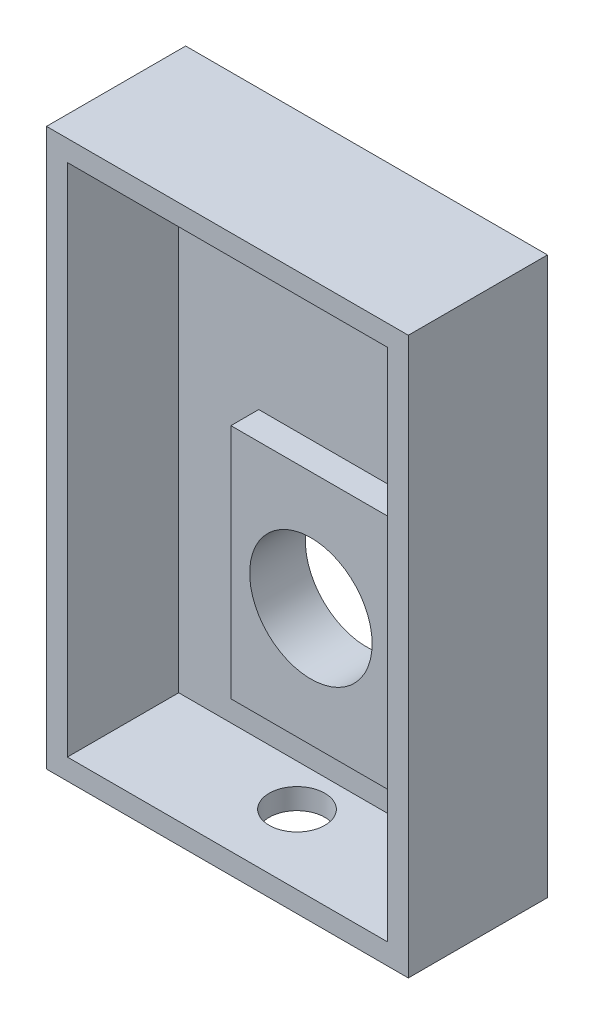
ISO-10303-21;
HEADER;
FILE_DESCRIPTION(('STEP AP214'),'2;1');
FILE_NAME('part.step','',(''),(''),'','','');
FILE_SCHEMA(('AUTOMOTIVE_DESIGN { 1 0 10303 214 1 1 1 1 }'));
ENDSEC;
DATA;
#1=APPLICATION_CONTEXT('core data for automotive mechanical design processes');
#2=APPLICATION_PROTOCOL_DEFINITION('international standard','automotive_design',2000,#1);
#3=PRODUCT_CONTEXT('',#1,'mechanical');
#4=PRODUCT('Part','Part','',(#3));
#5=PRODUCT_RELATED_PRODUCT_CATEGORY('part','',(#4));
#6=PRODUCT_DEFINITION_FORMATION('','',#4);
#7=PRODUCT_DEFINITION_CONTEXT('part definition',#1,'design');
#8=PRODUCT_DEFINITION('design','',#6,#7);
#9=PRODUCT_DEFINITION_SHAPE('','',#8);
#10=(LENGTH_UNIT() NAMED_UNIT(*) SI_UNIT(.MILLI.,.METRE.));
#11=(NAMED_UNIT(*) PLANE_ANGLE_UNIT() SI_UNIT($,.RADIAN.));
#12=(NAMED_UNIT(*) SI_UNIT($,.STERADIAN.) SOLID_ANGLE_UNIT());
#13=UNCERTAINTY_MEASURE_WITH_UNIT(LENGTH_MEASURE(1.E-05),#10,'distance_accuracy_value','');
#14=(GEOMETRIC_REPRESENTATION_CONTEXT(3) GLOBAL_UNCERTAINTY_ASSIGNED_CONTEXT((#13)) GLOBAL_UNIT_ASSIGNED_CONTEXT((#10,
#11,#12)) REPRESENTATION_CONTEXT('',''));
#15=CARTESIAN_POINT('',(0.,0.,0.));
#16=DIRECTION('',(0.,0.,1.));
#17=DIRECTION('',(1.,0.,0.));
#18=AXIS2_PLACEMENT_3D('',#15,#16,#17);
#19=CARTESIAN_POINT('',(0.,0.,2.));
#20=DIRECTION('',(0.,0.,1.));
#21=DIRECTION('',(1.,0.,0.));
#22=AXIS2_PLACEMENT_3D('',#19,#20,#21);
#23=PLANE('',#22);
#24=DIRECTION('',(-1.,0.,0.));
#25=VECTOR('',#24,1.);
#26=CARTESIAN_POINT('',(24.5,-1.5,2.));
#27=LINE('',#26,#25);
#28=CARTESIAN_POINT('',(24.5,-1.5,2.));
#29=VERTEX_POINT('',#28);
#30=CARTESIAN_POINT('',(1.5,-1.5,2.));
#31=VERTEX_POINT('',#30);
#32=EDGE_CURVE('E51',#29,#31,#27,.T.);
#33=ORIENTED_EDGE('',*,*,#32,.T.);
#34=DIRECTION('',(0.,-1.,0.));
#35=VECTOR('',#34,1.);
#36=CARTESIAN_POINT('',(1.5,-1.5,2.));
#37=LINE('',#36,#35);
#38=CARTESIAN_POINT('',(1.5,-38.5,2.));
#39=VERTEX_POINT('',#38);
#40=EDGE_CURVE('E55',#31,#39,#37,.T.);
#41=ORIENTED_EDGE('',*,*,#40,.T.);
#42=DIRECTION('',(1.,0.,0.));
#43=VECTOR('',#42,1.);
#44=CARTESIAN_POINT('',(1.5,-38.5,2.));
#45=LINE('',#44,#43);
#46=CARTESIAN_POINT('',(24.5,-38.5,2.));
#47=VERTEX_POINT('',#46);
#48=EDGE_CURVE('E154',#39,#47,#45,.T.);
#49=ORIENTED_EDGE('',*,*,#48,.T.);
#50=DIRECTION('',(0.,1.,0.));
#51=VECTOR('',#50,1.);
#52=CARTESIAN_POINT('',(24.5,-38.5,2.));
#53=LINE('',#52,#51);
#54=EDGE_CURVE('E134',#47,#29,#53,.T.);
#55=ORIENTED_EDGE('',*,*,#54,.T.);
#56=EDGE_LOOP('',(#33,#41,#49,#55));
#57=FACE_BOUND('',#56,.T.);
#58=DIRECTION('',(1.,0.,0.));
#59=VECTOR('',#58,1.);
#60=CARTESIAN_POINT('',(7.25,-35.,2.));
#61=LINE('',#60,#59);
#62=CARTESIAN_POINT('',(7.25,-35.,2.));
#63=VERTEX_POINT('',#62);
#64=CARTESIAN_POINT('',(18.75,-35.,2.));
#65=VERTEX_POINT('',#64);
#66=EDGE_CURVE('E190',#63,#65,#61,.T.);
#67=ORIENTED_EDGE('',*,*,#66,.F.);
#68=DIRECTION('',(0.,-1.,0.));
#69=VECTOR('',#68,1.);
#70=CARTESIAN_POINT('',(7.25,-18.,2.));
#71=LINE('',#70,#69);
#72=CARTESIAN_POINT('',(7.25,-18.,2.));
#73=VERTEX_POINT('',#72);
#74=EDGE_CURVE('E176',#73,#63,#71,.T.);
#75=ORIENTED_EDGE('',*,*,#74,.F.);
#76=DIRECTION('',(-1.,0.,0.));
#77=VECTOR('',#76,1.);
#78=CARTESIAN_POINT('',(7.25,-18.,2.));
#79=LINE('',#78,#77);
#80=CARTESIAN_POINT('',(18.75,-18.,2.));
#81=VERTEX_POINT('',#80);
#82=EDGE_CURVE('E181',#81,#73,#79,.T.);
#83=ORIENTED_EDGE('',*,*,#82,.F.);
#84=DIRECTION('',(0.,1.,0.));
#85=VECTOR('',#84,1.);
#86=CARTESIAN_POINT('',(18.75,-18.,2.));
#87=LINE('',#86,#85);
#88=EDGE_CURVE('E192',#65,#81,#87,.T.);
#89=ORIENTED_EDGE('',*,*,#88,.F.);
#90=EDGE_LOOP('',(#67,#75,#83,#89));
#91=FACE_BOUND('',#90,.T.);
#92=ADVANCED_FACE('F35',(#57,#91),#23,.T.);
#93=CARTESIAN_POINT('',(0.,0.,0.));
#94=DIRECTION('',(0.,0.,1.));
#95=DIRECTION('',(1.,0.,0.));
#96=AXIS2_PLACEMENT_3D('',#93,#94,#95);
#97=PLANE('',#96);
#98=DIRECTION('',(0.,-1.,0.));
#99=VECTOR('',#98,1.);
#100=CARTESIAN_POINT('',(0.,0.,0.));
#101=LINE('',#100,#99);
#102=CARTESIAN_POINT('',(0.,0.,0.));
#103=VERTEX_POINT('',#102);
#104=CARTESIAN_POINT('',(0.,-40.,0.));
#105=VERTEX_POINT('',#104);
#106=EDGE_CURVE('E208',#103,#105,#101,.T.);
#107=ORIENTED_EDGE('',*,*,#106,.F.);
#108=DIRECTION('',(-1.,0.,0.));
#109=VECTOR('',#108,1.);
#110=CARTESIAN_POINT('',(0.,0.,0.));
#111=LINE('',#110,#109);
#112=CARTESIAN_POINT('',(26.,0.,0.));
#113=VERTEX_POINT('',#112);
#114=EDGE_CURVE('E215',#113,#103,#111,.T.);
#115=ORIENTED_EDGE('',*,*,#114,.F.);
#116=DIRECTION('',(0.,1.,0.));
#117=VECTOR('',#116,1.);
#118=CARTESIAN_POINT('',(26.,0.,0.));
#119=LINE('',#118,#117);
#120=CARTESIAN_POINT('',(26.,-40.,0.));
#121=VERTEX_POINT('',#120);
#122=EDGE_CURVE('E213',#121,#113,#119,.T.);
#123=ORIENTED_EDGE('',*,*,#122,.F.);
#124=DIRECTION('',(1.,0.,0.));
#125=VECTOR('',#124,1.);
#126=CARTESIAN_POINT('',(0.,-40.,0.));
#127=LINE('',#126,#125);
#128=EDGE_CURVE('E211',#105,#121,#127,.T.);
#129=ORIENTED_EDGE('',*,*,#128,.F.);
#130=EDGE_LOOP('',(#107,#115,#123,#129));
#131=FACE_BOUND('',#130,.T.);
#132=CARTESIAN_POINT('',(13.,-26.5,0.));
#133=DIRECTION('',(0.,0.,1.));
#134=DIRECTION('',(1.,0.,0.));
#135=AXIS2_PLACEMENT_3D('',#132,#133,#134);
#136=CIRCLE('',#135,4.4);
#137=CARTESIAN_POINT('',(17.4,-26.5,0.));
#138=VERTEX_POINT('',#137);
#139=EDGE_CURVE('E205',#138,#138,#136,.T.);
#140=ORIENTED_EDGE('',*,*,#139,.T.);
#141=EDGE_LOOP('',(#140));
#142=FACE_BOUND('',#141,.T.);
#143=ADVANCED_FACE('F233',(#131,#142),#97,.F.);
#144=CARTESIAN_POINT('',(0.,0.,2.));
#145=DIRECTION('',(1.,0.,0.));
#146=DIRECTION('',(0.,0.,-1.));
#147=AXIS2_PLACEMENT_3D('',#144,#145,#146);
#148=PLANE('',#147);
#149=ORIENTED_EDGE('',*,*,#106,.T.);
#150=DIRECTION('',(0.,0.,-1.));
#151=VECTOR('',#150,1.);
#152=CARTESIAN_POINT('',(0.,-40.,2.));
#153=LINE('',#152,#151);
#154=CARTESIAN_POINT('',(0.,-40.,10.));
#155=VERTEX_POINT('',#154);
#156=EDGE_CURVE('E11',#155,#105,#153,.T.);
#157=ORIENTED_EDGE('',*,*,#156,.F.);
#158=DIRECTION('',(0.,-1.,0.));
#159=VECTOR('',#158,1.);
#160=CARTESIAN_POINT('',(0.,0.,10.));
#161=LINE('',#160,#159);
#162=CARTESIAN_POINT('',(0.,0.,10.));
#163=VERTEX_POINT('',#162);
#164=EDGE_CURVE('E164',#163,#155,#161,.T.);
#165=ORIENTED_EDGE('',*,*,#164,.F.);
#166=DIRECTION('',(0.,0.,-1.));
#167=VECTOR('',#166,1.);
#168=CARTESIAN_POINT('',(0.,0.,2.));
#169=LINE('',#168,#167);
#170=EDGE_CURVE('E217',#163,#103,#169,.T.);
#171=ORIENTED_EDGE('',*,*,#170,.T.);
#172=EDGE_LOOP('',(#149,#157,#165,#171));
#173=FACE_BOUND('',#172,.T.);
#174=ADVANCED_FACE('F37',(#173),#148,.F.);
#175=CARTESIAN_POINT('',(0.,-40.,2.));
#176=DIRECTION('',(0.,1.,0.));
#177=DIRECTION('',(0.,0.,1.));
#178=AXIS2_PLACEMENT_3D('',#175,#176,#177);
#179=PLANE('',#178);
#180=CARTESIAN_POINT('',(13.,-40.,5.));
#181=DIRECTION('',(0.,-1.,0.));
#182=DIRECTION('',(0.,0.,-1.));
#183=AXIS2_PLACEMENT_3D('',#180,#181,#182);
#184=CIRCLE('',#183,2.);
#185=CARTESIAN_POINT('',(13.,-40.,3.));
#186=VERTEX_POINT('',#185);
#187=EDGE_CURVE('E439',#186,#186,#184,.T.);
#188=ORIENTED_EDGE('',*,*,#187,.F.);
#189=EDGE_LOOP('',(#188));
#190=FACE_BOUND('',#189,.T.);
#191=ORIENTED_EDGE('',*,*,#128,.T.);
#192=DIRECTION('',(0.,0.,-1.));
#193=VECTOR('',#192,1.);
#194=CARTESIAN_POINT('',(26.,-40.,2.));
#195=LINE('',#194,#193);
#196=CARTESIAN_POINT('',(26.,-40.,10.));
#197=VERTEX_POINT('',#196);
#198=EDGE_CURVE('E44',#197,#121,#195,.T.);
#199=ORIENTED_EDGE('',*,*,#198,.F.);
#200=DIRECTION('',(1.,0.,0.));
#201=VECTOR('',#200,1.);
#202=CARTESIAN_POINT('',(0.,-40.,10.));
#203=LINE('',#202,#201);
#204=EDGE_CURVE('E167',#155,#197,#203,.T.);
#205=ORIENTED_EDGE('',*,*,#204,.F.);
#206=ORIENTED_EDGE('',*,*,#156,.T.);
#207=EDGE_LOOP('',(#191,#199,#205,#206));
#208=FACE_BOUND('',#207,.T.);
#209=ADVANCED_FACE('F241',(#190,#208),#179,.F.);
#210=CARTESIAN_POINT('',(26.,0.,2.));
#211=DIRECTION('',(-1.,0.,0.));
#212=DIRECTION('',(0.,0.,1.));
#213=AXIS2_PLACEMENT_3D('',#210,#211,#212);
#214=PLANE('',#213);
#215=ORIENTED_EDGE('',*,*,#122,.T.);
#216=DIRECTION('',(0.,0.,-1.));
#217=VECTOR('',#216,1.);
#218=CARTESIAN_POINT('',(26.,0.,2.));
#219=LINE('',#218,#217);
#220=CARTESIAN_POINT('',(26.,0.,10.));
#221=VERTEX_POINT('',#220);
#222=EDGE_CURVE('E220',#221,#113,#219,.T.);
#223=ORIENTED_EDGE('',*,*,#222,.F.);
#224=DIRECTION('',(0.,1.,0.));
#225=VECTOR('',#224,1.);
#226=CARTESIAN_POINT('',(26.,-40.,10.));
#227=LINE('',#226,#225);
#228=EDGE_CURVE('E170',#197,#221,#227,.T.);
#229=ORIENTED_EDGE('',*,*,#228,.F.);
#230=ORIENTED_EDGE('',*,*,#198,.T.);
#231=EDGE_LOOP('',(#215,#223,#229,#230));
#232=FACE_BOUND('',#231,.T.);
#233=ADVANCED_FACE('F227',(#232),#214,.F.);
#234=CARTESIAN_POINT('',(0.,0.,2.));
#235=DIRECTION('',(0.,-1.,0.));
#236=DIRECTION('',(0.,0.,-1.));
#237=AXIS2_PLACEMENT_3D('',#234,#235,#236);
#238=PLANE('',#237);
#239=ORIENTED_EDGE('',*,*,#114,.T.);
#240=ORIENTED_EDGE('',*,*,#170,.F.);
#241=DIRECTION('',(-1.,0.,0.));
#242=VECTOR('',#241,1.);
#243=CARTESIAN_POINT('',(26.,0.,10.));
#244=LINE('',#243,#242);
#245=EDGE_CURVE('E139',#221,#163,#244,.T.);
#246=ORIENTED_EDGE('',*,*,#245,.F.);
#247=ORIENTED_EDGE('',*,*,#222,.T.);
#248=EDGE_LOOP('',(#239,#240,#246,#247));
#249=FACE_BOUND('',#248,.T.);
#250=ADVANCED_FACE('F236',(#249),#238,.F.);
#251=CARTESIAN_POINT('',(13.,-26.5,2.));
#252=DIRECTION('',(0.,0.,-1.));
#253=DIRECTION('',(-1.,0.,0.));
#254=AXIS2_PLACEMENT_3D('',#251,#252,#253);
#255=CYLINDRICAL_SURFACE('',#254,4.4);
#256=ORIENTED_EDGE('',*,*,#139,.F.);
#257=EDGE_LOOP('',(#256));
#258=FACE_BOUND('',#257,.T.);
#259=CARTESIAN_POINT('',(13.,-26.5,4.));
#260=DIRECTION('',(0.,0.,1.));
#261=DIRECTION('',(1.,0.,0.));
#262=AXIS2_PLACEMENT_3D('',#259,#260,#261);
#263=CIRCLE('',#262,4.4);
#264=CARTESIAN_POINT('',(17.4,-26.5,4.));
#265=VERTEX_POINT('',#264);
#266=EDGE_CURVE('E173',#265,#265,#263,.T.);
#267=ORIENTED_EDGE('',*,*,#266,.T.);
#268=EDGE_LOOP('',(#267));
#269=FACE_BOUND('',#268,.T.);
#270=ADVANCED_FACE('F258',(#258,#269),#255,.F.);
#271=CARTESIAN_POINT('',(0.,0.,4.));
#272=DIRECTION('',(0.,0.,1.));
#273=DIRECTION('',(1.,0.,0.));
#274=AXIS2_PLACEMENT_3D('',#271,#272,#273);
#275=PLANE('',#274);
#276=DIRECTION('',(0.,-1.,0.));
#277=VECTOR('',#276,1.);
#278=CARTESIAN_POINT('',(7.25,-18.,4.));
#279=LINE('',#278,#277);
#280=CARTESIAN_POINT('',(7.25,-18.,4.));
#281=VERTEX_POINT('',#280);
#282=CARTESIAN_POINT('',(7.25,-35.,4.));
#283=VERTEX_POINT('',#282);
#284=EDGE_CURVE('E177',#281,#283,#279,.T.);
#285=ORIENTED_EDGE('',*,*,#284,.T.);
#286=DIRECTION('',(1.,0.,0.));
#287=VECTOR('',#286,1.);
#288=CARTESIAN_POINT('',(7.25,-35.,4.));
#289=LINE('',#288,#287);
#290=CARTESIAN_POINT('',(18.75,-35.,4.));
#291=VERTEX_POINT('',#290);
#292=EDGE_CURVE('E180',#283,#291,#289,.T.);
#293=ORIENTED_EDGE('',*,*,#292,.T.);
#294=DIRECTION('',(0.,1.,0.));
#295=VECTOR('',#294,1.);
#296=CARTESIAN_POINT('',(18.75,-18.,4.));
#297=LINE('',#296,#295);
#298=CARTESIAN_POINT('',(18.75,-18.,4.));
#299=VERTEX_POINT('',#298);
#300=EDGE_CURVE('E183',#291,#299,#297,.T.);
#301=ORIENTED_EDGE('',*,*,#300,.T.);
#302=DIRECTION('',(-1.,0.,0.));
#303=VECTOR('',#302,1.);
#304=CARTESIAN_POINT('',(7.25,-18.,4.));
#305=LINE('',#304,#303);
#306=EDGE_CURVE('E185',#299,#281,#305,.T.);
#307=ORIENTED_EDGE('',*,*,#306,.T.);
#308=EDGE_LOOP('',(#285,#293,#301,#307));
#309=FACE_BOUND('',#308,.T.);
#310=ORIENTED_EDGE('',*,*,#266,.F.);
#311=EDGE_LOOP('',(#310));
#312=FACE_BOUND('',#311,.T.);
#313=ADVANCED_FACE('F265',(#309,#312),#275,.T.);
#314=CARTESIAN_POINT('',(7.25,-18.,4.));
#315=DIRECTION('',(1.,0.,0.));
#316=DIRECTION('',(0.,1.,0.));
#317=AXIS2_PLACEMENT_3D('',#314,#315,#316);
#318=PLANE('',#317);
#319=ORIENTED_EDGE('',*,*,#74,.T.);
#320=DIRECTION('',(0.,0.,-1.));
#321=VECTOR('',#320,1.);
#322=CARTESIAN_POINT('',(7.25,-35.,4.));
#323=LINE('',#322,#321);
#324=EDGE_CURVE('E203',#283,#63,#323,.T.);
#325=ORIENTED_EDGE('',*,*,#324,.F.);
#326=ORIENTED_EDGE('',*,*,#284,.F.);
#327=DIRECTION('',(0.,0.,-1.));
#328=VECTOR('',#327,1.);
#329=CARTESIAN_POINT('',(7.25,-18.,4.));
#330=LINE('',#329,#328);
#331=EDGE_CURVE('E187',#281,#73,#330,.T.);
#332=ORIENTED_EDGE('',*,*,#331,.T.);
#333=EDGE_LOOP('',(#319,#325,#326,#332));
#334=FACE_BOUND('',#333,.T.);
#335=ADVANCED_FACE('F270',(#334),#318,.F.);
#336=CARTESIAN_POINT('',(7.25,-35.,4.));
#337=DIRECTION('',(0.,1.,0.));
#338=DIRECTION('',(0.,0.,1.));
#339=AXIS2_PLACEMENT_3D('',#336,#337,#338);
#340=PLANE('',#339);
#341=ORIENTED_EDGE('',*,*,#66,.T.);
#342=DIRECTION('',(0.,0.,-1.));
#343=VECTOR('',#342,1.);
#344=CARTESIAN_POINT('',(18.75,-35.,4.));
#345=LINE('',#344,#343);
#346=EDGE_CURVE('E200',#291,#65,#345,.T.);
#347=ORIENTED_EDGE('',*,*,#346,.F.);
#348=ORIENTED_EDGE('',*,*,#292,.F.);
#349=ORIENTED_EDGE('',*,*,#324,.T.);
#350=EDGE_LOOP('',(#341,#347,#348,#349));
#351=FACE_BOUND('',#350,.T.);
#352=ADVANCED_FACE('F280',(#351),#340,.F.);
#353=CARTESIAN_POINT('',(18.75,-18.,4.));
#354=DIRECTION('',(-1.,0.,0.));
#355=DIRECTION('',(0.,-1.,0.));
#356=AXIS2_PLACEMENT_3D('',#353,#354,#355);
#357=PLANE('',#356);
#358=ORIENTED_EDGE('',*,*,#88,.T.);
#359=DIRECTION('',(0.,0.,-1.));
#360=VECTOR('',#359,1.);
#361=CARTESIAN_POINT('',(18.75,-18.,4.));
#362=LINE('',#361,#360);
#363=EDGE_CURVE('E198',#299,#81,#362,.T.);
#364=ORIENTED_EDGE('',*,*,#363,.F.);
#365=ORIENTED_EDGE('',*,*,#300,.F.);
#366=ORIENTED_EDGE('',*,*,#346,.T.);
#367=EDGE_LOOP('',(#358,#364,#365,#366));
#368=FACE_BOUND('',#367,.T.);
#369=ADVANCED_FACE('F288',(#368),#357,.F.);
#370=CARTESIAN_POINT('',(7.25,-18.,4.));
#371=DIRECTION('',(0.,-1.,0.));
#372=DIRECTION('',(0.,0.,-1.));
#373=AXIS2_PLACEMENT_3D('',#370,#371,#372);
#374=PLANE('',#373);
#375=ORIENTED_EDGE('',*,*,#82,.T.);
#376=ORIENTED_EDGE('',*,*,#331,.F.);
#377=ORIENTED_EDGE('',*,*,#306,.F.);
#378=ORIENTED_EDGE('',*,*,#363,.T.);
#379=EDGE_LOOP('',(#375,#376,#377,#378));
#380=FACE_BOUND('',#379,.T.);
#381=ADVANCED_FACE('F285',(#380),#374,.F.);
#382=CARTESIAN_POINT('',(0.,0.,10.));
#383=DIRECTION('',(0.,0.,1.));
#384=DIRECTION('',(1.,0.,0.));
#385=AXIS2_PLACEMENT_3D('',#382,#383,#384);
#386=PLANE('',#385);
#387=ORIENTED_EDGE('',*,*,#245,.T.);
#388=ORIENTED_EDGE('',*,*,#164,.T.);
#389=ORIENTED_EDGE('',*,*,#204,.T.);
#390=ORIENTED_EDGE('',*,*,#228,.T.);
#391=EDGE_LOOP('',(#387,#388,#389,#390));
#392=FACE_BOUND('',#391,.T.);
#393=DIRECTION('',(0.,-1.,0.));
#394=VECTOR('',#393,1.);
#395=CARTESIAN_POINT('',(1.5,-1.5,10.));
#396=LINE('',#395,#394);
#397=CARTESIAN_POINT('',(1.5,-1.5,10.));
#398=VERTEX_POINT('',#397);
#399=CARTESIAN_POINT('',(1.5,-38.5,10.));
#400=VERTEX_POINT('',#399);
#401=EDGE_CURVE('E133',#398,#400,#396,.T.);
#402=ORIENTED_EDGE('',*,*,#401,.F.);
#403=DIRECTION('',(-1.,0.,0.));
#404=VECTOR('',#403,1.);
#405=CARTESIAN_POINT('',(24.5,-1.5,10.));
#406=LINE('',#405,#404);
#407=CARTESIAN_POINT('',(24.5,-1.5,10.));
#408=VERTEX_POINT('',#407);
#409=EDGE_CURVE('E124',#408,#398,#406,.T.);
#410=ORIENTED_EDGE('',*,*,#409,.F.);
#411=DIRECTION('',(0.,1.,0.));
#412=VECTOR('',#411,1.);
#413=CARTESIAN_POINT('',(24.5,-38.5,10.));
#414=LINE('',#413,#412);
#415=CARTESIAN_POINT('',(24.5,-38.5,10.));
#416=VERTEX_POINT('',#415);
#417=EDGE_CURVE('E147',#416,#408,#414,.T.);
#418=ORIENTED_EDGE('',*,*,#417,.F.);
#419=DIRECTION('',(1.,0.,0.));
#420=VECTOR('',#419,1.);
#421=CARTESIAN_POINT('',(1.5,-38.5,10.));
#422=LINE('',#421,#420);
#423=EDGE_CURVE('E145',#400,#416,#422,.T.);
#424=ORIENTED_EDGE('',*,*,#423,.F.);
#425=EDGE_LOOP('',(#402,#410,#418,#424));
#426=FACE_BOUND('',#425,.T.);
#427=ADVANCED_FACE('F143',(#392,#426),#386,.T.);
#428=CARTESIAN_POINT('',(24.5,-1.5,10.));
#429=DIRECTION('',(0.,-1.,0.));
#430=DIRECTION('',(1.,0.,0.));
#431=AXIS2_PLACEMENT_3D('',#428,#429,#430);
#432=PLANE('',#431);
#433=ORIENTED_EDGE('',*,*,#32,.F.);
#434=DIRECTION('',(0.,0.,-1.));
#435=VECTOR('',#434,1.);
#436=CARTESIAN_POINT('',(24.5,-1.5,10.));
#437=LINE('',#436,#435);
#438=EDGE_CURVE('E129',#408,#29,#437,.T.);
#439=ORIENTED_EDGE('',*,*,#438,.F.);
#440=ORIENTED_EDGE('',*,*,#409,.T.);
#441=DIRECTION('',(0.,0.,-1.));
#442=VECTOR('',#441,1.);
#443=CARTESIAN_POINT('',(1.5,-1.5,10.));
#444=LINE('',#443,#442);
#445=EDGE_CURVE('E127',#398,#31,#444,.T.);
#446=ORIENTED_EDGE('',*,*,#445,.T.);
#447=EDGE_LOOP('',(#433,#439,#440,#446));
#448=FACE_BOUND('',#447,.T.);
#449=ADVANCED_FACE('F126',(#448),#432,.T.);
#450=CARTESIAN_POINT('',(1.5,-1.5,10.));
#451=DIRECTION('',(1.,0.,0.));
#452=DIRECTION('',(0.,1.,0.));
#453=AXIS2_PLACEMENT_3D('',#450,#451,#452);
#454=PLANE('',#453);
#455=ORIENTED_EDGE('',*,*,#40,.F.);
#456=ORIENTED_EDGE('',*,*,#445,.F.);
#457=ORIENTED_EDGE('',*,*,#401,.T.);
#458=DIRECTION('',(0.,0.,-1.));
#459=VECTOR('',#458,1.);
#460=CARTESIAN_POINT('',(1.5,-38.5,10.));
#461=LINE('',#460,#459);
#462=EDGE_CURVE('E140',#400,#39,#461,.T.);
#463=ORIENTED_EDGE('',*,*,#462,.T.);
#464=EDGE_LOOP('',(#455,#456,#457,#463));
#465=FACE_BOUND('',#464,.T.);
#466=ADVANCED_FACE('F137',(#465),#454,.T.);
#467=CARTESIAN_POINT('',(1.5,-38.5,10.));
#468=DIRECTION('',(0.,1.,0.));
#469=DIRECTION('',(0.,0.,1.));
#470=AXIS2_PLACEMENT_3D('',#467,#468,#469);
#471=PLANE('',#470);
#472=CARTESIAN_POINT('',(13.,-38.5,5.));
#473=DIRECTION('',(0.,1.,0.));
#474=DIRECTION('',(0.,0.,1.));
#475=AXIS2_PLACEMENT_3D('',#472,#473,#474);
#476=CIRCLE('',#475,2.);
#477=CARTESIAN_POINT('',(13.,-38.5,7.));
#478=VERTEX_POINT('',#477);
#479=EDGE_CURVE('E39',#478,#478,#476,.T.);
#480=ORIENTED_EDGE('',*,*,#479,.F.);
#481=EDGE_LOOP('',(#480));
#482=FACE_BOUND('',#481,.T.);
#483=ORIENTED_EDGE('',*,*,#48,.F.);
#484=ORIENTED_EDGE('',*,*,#462,.F.);
#485=ORIENTED_EDGE('',*,*,#423,.T.);
#486=DIRECTION('',(0.,0.,-1.));
#487=VECTOR('',#486,1.);
#488=CARTESIAN_POINT('',(24.5,-38.5,10.));
#489=LINE('',#488,#487);
#490=EDGE_CURVE('E158',#416,#47,#489,.T.);
#491=ORIENTED_EDGE('',*,*,#490,.T.);
#492=EDGE_LOOP('',(#483,#484,#485,#491));
#493=FACE_BOUND('',#492,.T.);
#494=ADVANCED_FACE('F334',(#482,#493),#471,.T.);
#495=CARTESIAN_POINT('',(24.5,-38.5,10.));
#496=DIRECTION('',(-1.,0.,0.));
#497=DIRECTION('',(0.,0.,1.));
#498=AXIS2_PLACEMENT_3D('',#495,#496,#497);
#499=PLANE('',#498);
#500=ORIENTED_EDGE('',*,*,#54,.F.);
#501=ORIENTED_EDGE('',*,*,#490,.F.);
#502=ORIENTED_EDGE('',*,*,#417,.T.);
#503=ORIENTED_EDGE('',*,*,#438,.T.);
#504=EDGE_LOOP('',(#500,#501,#502,#503));
#505=FACE_BOUND('',#504,.T.);
#506=ADVANCED_FACE('F342',(#505),#499,.T.);
#507=CARTESIAN_POINT('',(13.,-38.,5.));
#508=DIRECTION('',(0.,-1.,0.));
#509=DIRECTION('',(0.,0.,-1.));
#510=AXIS2_PLACEMENT_3D('',#507,#508,#509);
#511=CYLINDRICAL_SURFACE('',#510,2.);
#512=ORIENTED_EDGE('',*,*,#479,.T.);
#513=EDGE_LOOP('',(#512));
#514=FACE_BOUND('',#513,.T.);
#515=ORIENTED_EDGE('',*,*,#187,.T.);
#516=EDGE_LOOP('',(#515));
#517=FACE_BOUND('',#516,.T.);
#518=ADVANCED_FACE('F350',(#514,#517),#511,.F.);
#519=CLOSED_SHELL('',(#92,#143,#174,#209,#233,#250,#270,#313,#335,#352,#369,#381,#427,#449,#466,
#494,#506,#518));
#520=MANIFOLD_SOLID_BREP('B2',#519);
#521=ADVANCED_BREP_SHAPE_REPRESENTATION('',(#18,#520),#14);
#522=SHAPE_DEFINITION_REPRESENTATION(#9,#521);
ENDSEC;
END-ISO-10303-21;
